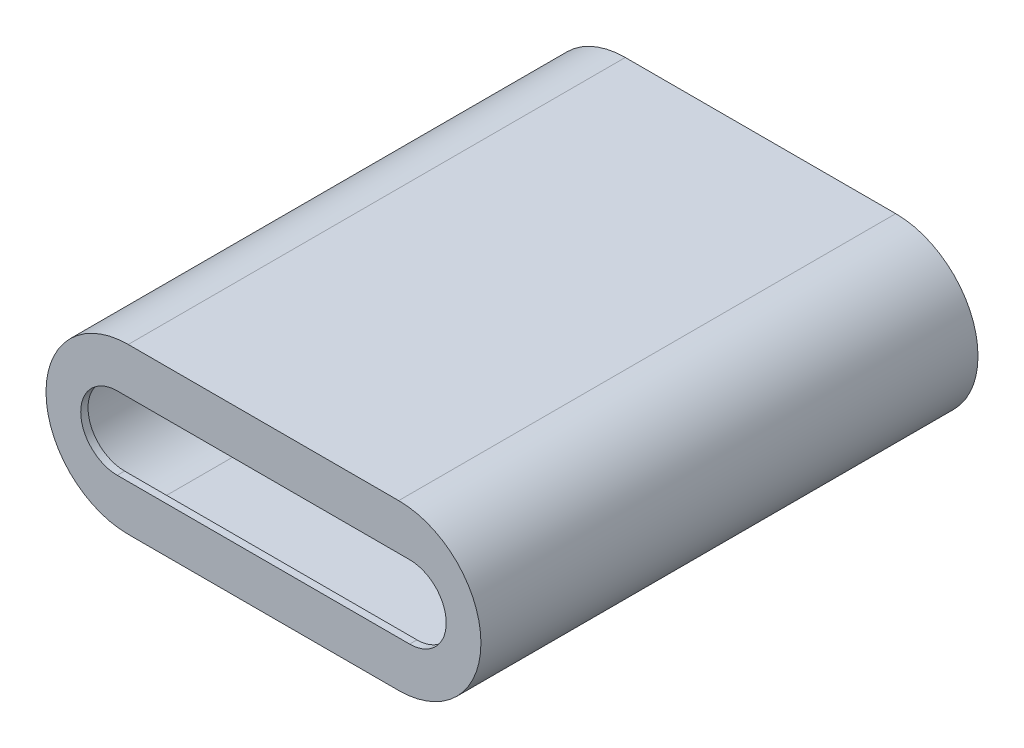
ISO-10303-21;
HEADER;
FILE_DESCRIPTION(('STEP AP214'),'2;1');
FILE_NAME('part.step','',(''),(''),'','','');
FILE_SCHEMA(('AUTOMOTIVE_DESIGN { 1 0 10303 214 1 1 1 1 }'));
ENDSEC;
DATA;
#1=APPLICATION_CONTEXT('core data for automotive mechanical design processes');
#2=APPLICATION_PROTOCOL_DEFINITION('international standard','automotive_design',2000,#1);
#3=PRODUCT_CONTEXT('',#1,'mechanical');
#4=PRODUCT('Part','Part','',(#3));
#5=PRODUCT_RELATED_PRODUCT_CATEGORY('part','',(#4));
#6=PRODUCT_DEFINITION_FORMATION('','',#4);
#7=PRODUCT_DEFINITION_CONTEXT('part definition',#1,'design');
#8=PRODUCT_DEFINITION('design','',#6,#7);
#9=PRODUCT_DEFINITION_SHAPE('','',#8);
#10=(LENGTH_UNIT() NAMED_UNIT(*) SI_UNIT(.MILLI.,.METRE.));
#11=(NAMED_UNIT(*) PLANE_ANGLE_UNIT() SI_UNIT($,.RADIAN.));
#12=(NAMED_UNIT(*) SI_UNIT($,.STERADIAN.) SOLID_ANGLE_UNIT());
#13=UNCERTAINTY_MEASURE_WITH_UNIT(LENGTH_MEASURE(1.E-05),#10,'distance_accuracy_value','');
#14=(GEOMETRIC_REPRESENTATION_CONTEXT(3) GLOBAL_UNCERTAINTY_ASSIGNED_CONTEXT((#13)) GLOBAL_UNIT_ASSIGNED_CONTEXT((#10,
#11,#12)) REPRESENTATION_CONTEXT('',''));
#15=CARTESIAN_POINT('',(0.,0.,0.));
#16=DIRECTION('',(0.,0.,1.));
#17=DIRECTION('',(1.,0.,0.));
#18=AXIS2_PLACEMENT_3D('',#15,#16,#17);
#19=CARTESIAN_POINT('',(-18.5,-9.25,34.));
#20=DIRECTION('',(0.,1.,0.));
#21=DIRECTION('',(-1.,0.,0.));
#22=AXIS2_PLACEMENT_3D('',#19,#20,#21);
#23=PLANE('',#22);
#24=DIRECTION('',(0.,0.,-1.));
#25=VECTOR('',#24,1.);
#26=CARTESIAN_POINT('',(18.5,-9.24999999999999,34.));
#27=LINE('',#26,#25);
#28=CARTESIAN_POINT('',(18.5,-9.24999999999999,33.));
#29=VERTEX_POINT('',#28);
#30=CARTESIAN_POINT('',(18.5,-9.25,8.));
#31=VERTEX_POINT('',#30);
#32=EDGE_CURVE('E328',#29,#31,#27,.T.);
#33=ORIENTED_EDGE('',*,*,#32,.T.);
#34=DIRECTION('',(1.,0.,0.));
#35=VECTOR('',#34,1.);
#36=CARTESIAN_POINT('',(-29.75,-9.25,8.));
#37=LINE('',#36,#35);
#38=CARTESIAN_POINT('',(-18.5,-9.25,8.));
#39=VERTEX_POINT('',#38);
#40=EDGE_CURVE('E413',#39,#31,#37,.T.);
#41=ORIENTED_EDGE('',*,*,#40,.F.);
#42=DIRECTION('',(0.,0.,-1.));
#43=VECTOR('',#42,1.);
#44=CARTESIAN_POINT('',(-18.5,-9.25,34.));
#45=LINE('',#44,#43);
#46=CARTESIAN_POINT('',(-18.5,-9.25,33.));
#47=VERTEX_POINT('',#46);
#48=EDGE_CURVE('E333',#47,#39,#45,.T.);
#49=ORIENTED_EDGE('',*,*,#48,.F.);
#50=DIRECTION('',(-1.,0.,0.));
#51=VECTOR('',#50,1.);
#52=CARTESIAN_POINT('',(-18.5,-9.25,33.));
#53=LINE('',#52,#51);
#54=EDGE_CURVE('E309',#29,#47,#53,.T.);
#55=ORIENTED_EDGE('',*,*,#54,.F.);
#56=EDGE_LOOP('',(#33,#41,#49,#55));
#57=FACE_BOUND('',#56,.T.);
#58=ADVANCED_FACE('F39',(#57),#23,.T.);
#59=CARTESIAN_POINT('',(-18.5,0.,34.));
#60=DIRECTION('',(0.,0.,-1.));
#61=DIRECTION('',(-1.,0.,0.));
#62=AXIS2_PLACEMENT_3D('',#59,#60,#61);
#63=CYLINDRICAL_SURFACE('',#62,11.25);
#64=CARTESIAN_POINT('',(-18.5,0.,8.));
#65=DIRECTION('',(0.,0.,-1.));
#66=DIRECTION('',(-1.,0.,0.));
#67=AXIS2_PLACEMENT_3D('',#64,#65,#66);
#68=CIRCLE('',#67,11.25);
#69=CARTESIAN_POINT('',(-18.5,-11.25,8.));
#70=VERTEX_POINT('',#69);
#71=CARTESIAN_POINT('',(-24.9031242374329,-9.25,8.));
#72=VERTEX_POINT('',#71);
#73=EDGE_CURVE('E224',#70,#72,#68,.T.);
#74=ORIENTED_EDGE('',*,*,#73,.F.);
#75=DIRECTION('',(0.,0.,-1.));
#76=VECTOR('',#75,1.);
#77=CARTESIAN_POINT('',(-18.5,-11.25,34.));
#78=LINE('',#77,#76);
#79=CARTESIAN_POINT('',(-18.5,-11.25,34.));
#80=VERTEX_POINT('',#79);
#81=EDGE_CURVE('E376',#80,#70,#78,.T.);
#82=ORIENTED_EDGE('',*,*,#81,.F.);
#83=CARTESIAN_POINT('',(-18.5,0.,34.));
#84=DIRECTION('',(0.,0.,1.));
#85=DIRECTION('',(1.,0.,0.));
#86=AXIS2_PLACEMENT_3D('',#83,#84,#85);
#87=CIRCLE('',#86,11.25);
#88=CARTESIAN_POINT('',(-18.5,11.25,34.));
#89=VERTEX_POINT('',#88);
#90=EDGE_CURVE('E338',#89,#80,#87,.T.);
#91=ORIENTED_EDGE('',*,*,#90,.F.);
#92=DIRECTION('',(0.,0.,-1.));
#93=VECTOR('',#92,1.);
#94=CARTESIAN_POINT('',(-18.5,11.25,34.));
#95=LINE('',#94,#93);
#96=CARTESIAN_POINT('',(-18.5,11.25,-34.));
#97=VERTEX_POINT('',#96);
#98=EDGE_CURVE('E352',#89,#97,#95,.T.);
#99=ORIENTED_EDGE('',*,*,#98,.T.);
#100=CARTESIAN_POINT('',(-18.5,0.,-34.));
#101=DIRECTION('',(0.,0.,1.));
#102=DIRECTION('',(1.,0.,0.));
#103=AXIS2_PLACEMENT_3D('',#100,#101,#102);
#104=CIRCLE('',#103,11.25);
#105=CARTESIAN_POINT('',(-18.5,-11.25,-34.));
#106=VERTEX_POINT('',#105);
#107=EDGE_CURVE('E337',#97,#106,#104,.T.);
#108=ORIENTED_EDGE('',*,*,#107,.T.);
#109=CARTESIAN_POINT('',(-18.5,-11.25,-8.00000000000001));
#110=VERTEX_POINT('',#109);
#111=EDGE_CURVE('E209',#110,#106,#78,.T.);
#112=ORIENTED_EDGE('',*,*,#111,.F.);
#113=CARTESIAN_POINT('',(-18.5,0.,-8.00000000000001));
#114=DIRECTION('',(0.,0.,-1.));
#115=DIRECTION('',(-1.,0.,0.));
#116=AXIS2_PLACEMENT_3D('',#113,#114,#115);
#117=CIRCLE('',#116,11.25);
#118=CARTESIAN_POINT('',(-24.9031242374328,-9.25,-8.00000000000001));
#119=VERTEX_POINT('',#118);
#120=EDGE_CURVE('E196',#110,#119,#117,.T.);
#121=ORIENTED_EDGE('',*,*,#120,.T.);
#122=DIRECTION('',(0.,0.,-1.));
#123=VECTOR('',#122,1.);
#124=CARTESIAN_POINT('',(-24.9031242374329,-9.24999999999999,34.));
#125=LINE('',#124,#123);
#126=EDGE_CURVE('E187',#119,#72,#125,.F.);
#127=ORIENTED_EDGE('',*,*,#126,.T.);
#128=EDGE_LOOP('',(#74,#82,#91,#99,#108,#112,#121,#127));
#129=FACE_BOUND('',#128,.T.);
#130=ADVANCED_FACE('F41',(#129),#63,.T.);
#131=CARTESIAN_POINT('',(-18.5,-11.25,34.));
#132=DIRECTION('',(0.,1.,0.));
#133=DIRECTION('',(-1.,0.,0.));
#134=AXIS2_PLACEMENT_3D('',#131,#132,#133);
#135=PLANE('',#134);
#136=DIRECTION('',(-1.,0.,0.));
#137=VECTOR('',#136,1.);
#138=CARTESIAN_POINT('',(-18.5,-11.25,8.));
#139=LINE('',#138,#137);
#140=CARTESIAN_POINT('',(18.5,-11.25,8.));
#141=VERTEX_POINT('',#140);
#142=EDGE_CURVE('E221',#141,#70,#139,.T.);
#143=ORIENTED_EDGE('',*,*,#142,.F.);
#144=DIRECTION('',(0.,0.,-1.));
#145=VECTOR('',#144,1.);
#146=CARTESIAN_POINT('',(18.5,-11.25,34.));
#147=LINE('',#146,#145);
#148=CARTESIAN_POINT('',(18.5,-11.25,34.));
#149=VERTEX_POINT('',#148);
#150=EDGE_CURVE('E372',#149,#141,#147,.T.);
#151=ORIENTED_EDGE('',*,*,#150,.F.);
#152=DIRECTION('',(1.,0.,0.));
#153=VECTOR('',#152,1.);
#154=CARTESIAN_POINT('',(-18.5,-11.25,34.));
#155=LINE('',#154,#153);
#156=EDGE_CURVE('E342',#80,#149,#155,.T.);
#157=ORIENTED_EDGE('',*,*,#156,.F.);
#158=ORIENTED_EDGE('',*,*,#81,.T.);
#159=EDGE_LOOP('',(#143,#151,#157,#158));
#160=FACE_BOUND('',#159,.T.);
#161=ADVANCED_FACE('F488',(#160),#135,.F.);
#162=CARTESIAN_POINT('',(18.5,0.,34.));
#163=DIRECTION('',(0.,0.,-1.));
#164=DIRECTION('',(-1.,0.,0.));
#165=AXIS2_PLACEMENT_3D('',#162,#163,#164);
#166=CYLINDRICAL_SURFACE('',#165,11.25);
#167=CARTESIAN_POINT('',(18.5,0.,8.));
#168=DIRECTION('',(0.,0.,-1.));
#169=DIRECTION('',(-1.,0.,0.));
#170=AXIS2_PLACEMENT_3D('',#167,#168,#169);
#171=CIRCLE('',#170,11.25);
#172=CARTESIAN_POINT('',(24.9031242374328,-9.25,8.));
#173=VERTEX_POINT('',#172);
#174=EDGE_CURVE('E11',#173,#141,#171,.T.);
#175=ORIENTED_EDGE('',*,*,#174,.F.);
#176=DIRECTION('',(0.,0.,-1.));
#177=VECTOR('',#176,1.);
#178=CARTESIAN_POINT('',(24.9031242374328,-9.24999999999999,34.));
#179=LINE('',#178,#177);
#180=CARTESIAN_POINT('',(24.9031242374328,-9.25,-8.00000000000001));
#181=VERTEX_POINT('',#180);
#182=EDGE_CURVE('E48',#173,#181,#179,.T.);
#183=ORIENTED_EDGE('',*,*,#182,.T.);
#184=CARTESIAN_POINT('',(18.5,0.,-8.00000000000001));
#185=DIRECTION('',(0.,0.,-1.));
#186=DIRECTION('',(-1.,0.,0.));
#187=AXIS2_PLACEMENT_3D('',#184,#185,#186);
#188=CIRCLE('',#187,11.25);
#189=CARTESIAN_POINT('',(18.5,-11.25,-8.00000000000001));
#190=VERTEX_POINT('',#189);
#191=EDGE_CURVE('E396',#181,#190,#188,.T.);
#192=ORIENTED_EDGE('',*,*,#191,.T.);
#193=CARTESIAN_POINT('',(18.5,-11.25,-34.));
#194=VERTEX_POINT('',#193);
#195=EDGE_CURVE('E371',#190,#194,#147,.T.);
#196=ORIENTED_EDGE('',*,*,#195,.T.);
#197=CARTESIAN_POINT('',(18.5,0.,-34.));
#198=DIRECTION('',(0.,0.,1.));
#199=DIRECTION('',(1.,0.,0.));
#200=AXIS2_PLACEMENT_3D('',#197,#198,#199);
#201=CIRCLE('',#200,11.25);
#202=CARTESIAN_POINT('',(18.5,11.25,-34.));
#203=VERTEX_POINT('',#202);
#204=EDGE_CURVE('E359',#194,#203,#201,.T.);
#205=ORIENTED_EDGE('',*,*,#204,.T.);
#206=DIRECTION('',(0.,0.,-1.));
#207=VECTOR('',#206,1.);
#208=CARTESIAN_POINT('',(18.5,11.25,34.));
#209=LINE('',#208,#207);
#210=CARTESIAN_POINT('',(18.5,11.25,34.));
#211=VERTEX_POINT('',#210);
#212=EDGE_CURVE('E367',#211,#203,#209,.T.);
#213=ORIENTED_EDGE('',*,*,#212,.F.);
#214=CARTESIAN_POINT('',(18.5,0.,34.));
#215=DIRECTION('',(0.,0.,1.));
#216=DIRECTION('',(1.,0.,0.));
#217=AXIS2_PLACEMENT_3D('',#214,#215,#216);
#218=CIRCLE('',#217,11.25);
#219=EDGE_CURVE('E346',#149,#211,#218,.T.);
#220=ORIENTED_EDGE('',*,*,#219,.F.);
#221=ORIENTED_EDGE('',*,*,#150,.T.);
#222=EDGE_LOOP('',(#175,#183,#192,#196,#205,#213,#220,#221));
#223=FACE_BOUND('',#222,.T.);
#224=ADVANCED_FACE('F402',(#223),#166,.T.);
#225=CARTESIAN_POINT('',(18.5,0.,-33.));
#226=DIRECTION('',(0.,0.,1.));
#227=DIRECTION('',(1.,0.,0.));
#228=AXIS2_PLACEMENT_3D('',#225,#226,#227);
#229=PLANE('',#228);
#230=CARTESIAN_POINT('',(-20.,0.,-33.));
#231=DIRECTION('',(0.,0.,1.));
#232=DIRECTION('',(1.,0.,0.));
#233=AXIS2_PLACEMENT_3D('',#230,#231,#232);
#234=CIRCLE('',#233,5.);
#235=CARTESIAN_POINT('',(-20.,5.,-33.));
#236=VERTEX_POINT('',#235);
#237=CARTESIAN_POINT('',(-20.,-5.,-33.));
#238=VERTEX_POINT('',#237);
#239=EDGE_CURVE('E286',#236,#238,#234,.T.);
#240=ORIENTED_EDGE('',*,*,#239,.F.);
#241=DIRECTION('',(-1.,0.,0.));
#242=VECTOR('',#241,1.);
#243=CARTESIAN_POINT('',(18.5,5.,-33.));
#244=LINE('',#243,#242);
#245=CARTESIAN_POINT('',(20.,5.,-33.));
#246=VERTEX_POINT('',#245);
#247=EDGE_CURVE('E283',#246,#236,#244,.T.);
#248=ORIENTED_EDGE('',*,*,#247,.F.);
#249=CARTESIAN_POINT('',(20.,0.,-33.));
#250=DIRECTION('',(0.,0.,1.));
#251=DIRECTION('',(1.,0.,0.));
#252=AXIS2_PLACEMENT_3D('',#249,#250,#251);
#253=CIRCLE('',#252,5.);
#254=CARTESIAN_POINT('',(20.,-5.,-33.));
#255=VERTEX_POINT('',#254);
#256=EDGE_CURVE('E280',#255,#246,#253,.T.);
#257=ORIENTED_EDGE('',*,*,#256,.F.);
#258=DIRECTION('',(1.,0.,0.));
#259=VECTOR('',#258,1.);
#260=CARTESIAN_POINT('',(18.5,-5.,-33.));
#261=LINE('',#260,#259);
#262=EDGE_CURVE('E263',#238,#255,#261,.T.);
#263=ORIENTED_EDGE('',*,*,#262,.F.);
#264=EDGE_LOOP('',(#240,#248,#257,#263));
#265=FACE_BOUND('',#264,.T.);
#266=DIRECTION('',(1.,0.,0.));
#267=VECTOR('',#266,1.);
#268=CARTESIAN_POINT('',(-18.5,9.25,-33.));
#269=LINE('',#268,#267);
#270=CARTESIAN_POINT('',(-18.5,9.25,-33.));
#271=VERTEX_POINT('',#270);
#272=CARTESIAN_POINT('',(18.5,9.25000000000001,-33.));
#273=VERTEX_POINT('',#272);
#274=EDGE_CURVE('E290',#271,#273,#269,.T.);
#275=ORIENTED_EDGE('',*,*,#274,.F.);
#276=CARTESIAN_POINT('',(-18.5,0.,-33.));
#277=DIRECTION('',(0.,0.,1.));
#278=DIRECTION('',(1.,0.,0.));
#279=AXIS2_PLACEMENT_3D('',#276,#277,#278);
#280=CIRCLE('',#279,9.25);
#281=CARTESIAN_POINT('',(-18.5,-9.25,-33.));
#282=VERTEX_POINT('',#281);
#283=EDGE_CURVE('E301',#271,#282,#280,.T.);
#284=ORIENTED_EDGE('',*,*,#283,.T.);
#285=DIRECTION('',(1.,0.,0.));
#286=VECTOR('',#285,1.);
#287=CARTESIAN_POINT('',(-18.5,-9.25,-33.));
#288=LINE('',#287,#286);
#289=CARTESIAN_POINT('',(18.5,-9.24999999999999,-33.));
#290=VERTEX_POINT('',#289);
#291=EDGE_CURVE('E297',#282,#290,#288,.T.);
#292=ORIENTED_EDGE('',*,*,#291,.T.);
#293=CARTESIAN_POINT('',(18.5,0.,-33.));
#294=DIRECTION('',(0.,0.,1.));
#295=DIRECTION('',(1.,0.,0.));
#296=AXIS2_PLACEMENT_3D('',#293,#294,#295);
#297=CIRCLE('',#296,9.25);
#298=EDGE_CURVE('E293',#290,#273,#297,.T.);
#299=ORIENTED_EDGE('',*,*,#298,.T.);
#300=EDGE_LOOP('',(#275,#284,#292,#299));
#301=FACE_BOUND('',#300,.T.);
#302=ADVANCED_FACE('F438',(#265,#301),#229,.T.);
#303=CARTESIAN_POINT('',(-18.5,0.,33.));
#304=DIRECTION('',(0.,0.,1.));
#305=DIRECTION('',(1.,0.,0.));
#306=AXIS2_PLACEMENT_3D('',#303,#304,#305);
#307=PLANE('',#306);
#308=DIRECTION('',(-1.,0.,0.));
#309=VECTOR('',#308,1.);
#310=CARTESIAN_POINT('',(-18.5,5.,33.));
#311=LINE('',#310,#309);
#312=CARTESIAN_POINT('',(20.,5.,33.));
#313=VERTEX_POINT('',#312);
#314=CARTESIAN_POINT('',(-20.,5.,33.));
#315=VERTEX_POINT('',#314);
#316=EDGE_CURVE('E388',#313,#315,#311,.T.);
#317=ORIENTED_EDGE('',*,*,#316,.T.);
#318=CARTESIAN_POINT('',(-20.,0.,33.));
#319=DIRECTION('',(0.,0.,1.));
#320=DIRECTION('',(1.,0.,0.));
#321=AXIS2_PLACEMENT_3D('',#318,#319,#320);
#322=CIRCLE('',#321,5.);
#323=CARTESIAN_POINT('',(-20.,-5.,33.));
#324=VERTEX_POINT('',#323);
#325=EDGE_CURVE('E392',#315,#324,#322,.T.);
#326=ORIENTED_EDGE('',*,*,#325,.T.);
#327=DIRECTION('',(1.,0.,0.));
#328=VECTOR('',#327,1.);
#329=CARTESIAN_POINT('',(-18.5,-5.,33.));
#330=LINE('',#329,#328);
#331=CARTESIAN_POINT('',(20.,-5.,33.));
#332=VERTEX_POINT('',#331);
#333=EDGE_CURVE('E380',#324,#332,#330,.T.);
#334=ORIENTED_EDGE('',*,*,#333,.T.);
#335=CARTESIAN_POINT('',(20.,0.,33.));
#336=DIRECTION('',(0.,0.,1.));
#337=DIRECTION('',(1.,0.,0.));
#338=AXIS2_PLACEMENT_3D('',#335,#336,#337);
#339=CIRCLE('',#338,5.);
#340=EDGE_CURVE('E384',#332,#313,#339,.T.);
#341=ORIENTED_EDGE('',*,*,#340,.T.);
#342=EDGE_LOOP('',(#317,#326,#334,#341));
#343=FACE_BOUND('',#342,.T.);
#344=CARTESIAN_POINT('',(-18.5,0.,33.));
#345=DIRECTION('',(0.,0.,1.));
#346=DIRECTION('',(1.,0.,0.));
#347=AXIS2_PLACEMENT_3D('',#344,#345,#346);
#348=CIRCLE('',#347,9.25);
#349=CARTESIAN_POINT('',(-18.5,9.25,33.));
#350=VERTEX_POINT('',#349);
#351=EDGE_CURVE('E305',#350,#47,#348,.T.);
#352=ORIENTED_EDGE('',*,*,#351,.F.);
#353=DIRECTION('',(-1.,0.,0.));
#354=VECTOR('',#353,1.);
#355=CARTESIAN_POINT('',(-18.5,9.25,33.));
#356=LINE('',#355,#354);
#357=CARTESIAN_POINT('',(18.5,9.25000000000001,33.));
#358=VERTEX_POINT('',#357);
#359=EDGE_CURVE('E316',#358,#350,#356,.T.);
#360=ORIENTED_EDGE('',*,*,#359,.F.);
#361=CARTESIAN_POINT('',(18.5,0.,33.));
#362=DIRECTION('',(0.,0.,1.));
#363=DIRECTION('',(1.,0.,0.));
#364=AXIS2_PLACEMENT_3D('',#361,#362,#363);
#365=CIRCLE('',#364,9.25);
#366=EDGE_CURVE('E312',#29,#358,#365,.T.);
#367=ORIENTED_EDGE('',*,*,#366,.F.);
#368=ORIENTED_EDGE('',*,*,#54,.T.);
#369=EDGE_LOOP('',(#352,#360,#367,#368));
#370=FACE_BOUND('',#369,.T.);
#371=ADVANCED_FACE('F428',(#343,#370),#307,.F.);
#372=CARTESIAN_POINT('',(-18.5,9.25,34.));
#373=DIRECTION('',(0.,-1.,0.));
#374=DIRECTION('',(1.,0.,0.));
#375=AXIS2_PLACEMENT_3D('',#372,#373,#374);
#376=PLANE('',#375);
#377=ORIENTED_EDGE('',*,*,#274,.T.);
#378=DIRECTION('',(0.,0.,-1.));
#379=VECTOR('',#378,1.);
#380=CARTESIAN_POINT('',(18.5,9.25000000000001,34.));
#381=LINE('',#380,#379);
#382=EDGE_CURVE('E323',#358,#273,#381,.T.);
#383=ORIENTED_EDGE('',*,*,#382,.F.);
#384=ORIENTED_EDGE('',*,*,#359,.T.);
#385=DIRECTION('',(0.,0.,-1.));
#386=VECTOR('',#385,1.);
#387=CARTESIAN_POINT('',(-18.5,9.25,34.));
#388=LINE('',#387,#386);
#389=EDGE_CURVE('E320',#350,#271,#388,.T.);
#390=ORIENTED_EDGE('',*,*,#389,.T.);
#391=EDGE_LOOP('',(#377,#383,#384,#390));
#392=FACE_BOUND('',#391,.T.);
#393=ADVANCED_FACE('F431',(#392),#376,.T.);
#394=CARTESIAN_POINT('',(18.5,0.,34.));
#395=DIRECTION('',(0.,0.,-1.));
#396=DIRECTION('',(-1.,0.,0.));
#397=AXIS2_PLACEMENT_3D('',#394,#395,#396);
#398=CYLINDRICAL_SURFACE('',#397,9.25);
#399=ORIENTED_EDGE('',*,*,#298,.F.);
#400=CARTESIAN_POINT('',(18.5,-9.25,-8.));
#401=VERTEX_POINT('',#400);
#402=EDGE_CURVE('E327',#401,#290,#27,.T.);
#403=ORIENTED_EDGE('',*,*,#402,.F.);
#404=DIRECTION('',(0.,0.,-1.));
#405=VECTOR('',#404,1.);
#406=CARTESIAN_POINT('',(18.5,-9.24999999999999,34.));
#407=LINE('',#406,#405);
#408=EDGE_CURVE('E218',#31,#401,#407,.T.);
#409=ORIENTED_EDGE('',*,*,#408,.F.);
#410=ORIENTED_EDGE('',*,*,#32,.F.);
#411=ORIENTED_EDGE('',*,*,#366,.T.);
#412=ORIENTED_EDGE('',*,*,#382,.T.);
#413=EDGE_LOOP('',(#399,#403,#409,#410,#411,#412));
#414=FACE_BOUND('',#413,.T.);
#415=ADVANCED_FACE('F435',(#414),#398,.F.);
#416=DIRECTION('',(1.,0.,0.));
#417=VECTOR('',#416,1.);
#418=CARTESIAN_POINT('',(-29.75,-9.25,-8.));
#419=LINE('',#418,#417);
#420=CARTESIAN_POINT('',(-18.5,-9.25,-8.00000000000001));
#421=VERTEX_POINT('',#420);
#422=EDGE_CURVE('E201',#421,#401,#419,.T.);
#423=ORIENTED_EDGE('',*,*,#422,.T.);
#424=ORIENTED_EDGE('',*,*,#402,.T.);
#425=ORIENTED_EDGE('',*,*,#291,.F.);
#426=EDGE_CURVE('E332',#421,#282,#45,.T.);
#427=ORIENTED_EDGE('',*,*,#426,.F.);
#428=EDGE_LOOP('',(#423,#424,#425,#427));
#429=FACE_BOUND('',#428,.T.);
#430=ADVANCED_FACE('F441',(#429),#23,.T.);
#431=CARTESIAN_POINT('',(-18.5,0.,34.));
#432=DIRECTION('',(0.,0.,-1.));
#433=DIRECTION('',(-1.,0.,0.));
#434=AXIS2_PLACEMENT_3D('',#431,#432,#433);
#435=CYLINDRICAL_SURFACE('',#434,9.25);
#436=ORIENTED_EDGE('',*,*,#283,.F.);
#437=ORIENTED_EDGE('',*,*,#389,.F.);
#438=ORIENTED_EDGE('',*,*,#351,.T.);
#439=ORIENTED_EDGE('',*,*,#48,.T.);
#440=DIRECTION('',(0.,0.,-1.));
#441=VECTOR('',#440,1.);
#442=CARTESIAN_POINT('',(-18.5,-9.25,34.));
#443=LINE('',#442,#441);
#444=EDGE_CURVE('E195',#39,#421,#443,.T.);
#445=ORIENTED_EDGE('',*,*,#444,.T.);
#446=ORIENTED_EDGE('',*,*,#426,.T.);
#447=EDGE_LOOP('',(#436,#437,#438,#439,#445,#446));
#448=FACE_BOUND('',#447,.T.);
#449=ADVANCED_FACE('F425',(#448),#435,.F.);
#450=CARTESIAN_POINT('',(-20.,-5.,-34.));
#451=DIRECTION('',(0.,-1.,0.));
#452=DIRECTION('',(0.,0.,-1.));
#453=AXIS2_PLACEMENT_3D('',#450,#451,#452);
#454=PLANE('',#453);
#455=DIRECTION('',(0.,0.,1.));
#456=VECTOR('',#455,1.);
#457=CARTESIAN_POINT('',(-20.,-5.,-34.));
#458=LINE('',#457,#456);
#459=CARTESIAN_POINT('',(-20.,-5.,34.));
#460=VERTEX_POINT('',#459);
#461=EDGE_CURVE('E258',#324,#460,#458,.T.);
#462=ORIENTED_EDGE('',*,*,#461,.T.);
#463=DIRECTION('',(1.,0.,0.));
#464=VECTOR('',#463,1.);
#465=CARTESIAN_POINT('',(-20.,-5.,34.));
#466=LINE('',#465,#464);
#467=CARTESIAN_POINT('',(20.,-5.,34.));
#468=VERTEX_POINT('',#467);
#469=EDGE_CURVE('E230',#460,#468,#466,.T.);
#470=ORIENTED_EDGE('',*,*,#469,.T.);
#471=DIRECTION('',(0.,0.,1.));
#472=VECTOR('',#471,1.);
#473=CARTESIAN_POINT('',(20.,-5.,-34.));
#474=LINE('',#473,#472);
#475=EDGE_CURVE('E274',#332,#468,#474,.T.);
#476=ORIENTED_EDGE('',*,*,#475,.F.);
#477=ORIENTED_EDGE('',*,*,#333,.F.);
#478=EDGE_LOOP('',(#462,#470,#476,#477));
#479=FACE_BOUND('',#478,.T.);
#480=ADVANCED_FACE('F452',(#479),#454,.F.);
#481=CARTESIAN_POINT('',(20.,0.,-34.));
#482=DIRECTION('',(0.,0.,1.));
#483=DIRECTION('',(1.,0.,0.));
#484=AXIS2_PLACEMENT_3D('',#481,#482,#483);
#485=CYLINDRICAL_SURFACE('',#484,5.);
#486=ORIENTED_EDGE('',*,*,#475,.T.);
#487=CARTESIAN_POINT('',(20.,0.,34.));
#488=DIRECTION('',(0.,0.,1.));
#489=DIRECTION('',(1.,0.,0.));
#490=AXIS2_PLACEMENT_3D('',#487,#488,#489);
#491=CIRCLE('',#490,5.);
#492=CARTESIAN_POINT('',(20.,5.,34.));
#493=VERTEX_POINT('',#492);
#494=EDGE_CURVE('E234',#468,#493,#491,.T.);
#495=ORIENTED_EDGE('',*,*,#494,.T.);
#496=DIRECTION('',(0.,0.,1.));
#497=VECTOR('',#496,1.);
#498=CARTESIAN_POINT('',(20.,5.,-34.));
#499=LINE('',#498,#497);
#500=EDGE_CURVE('E269',#313,#493,#499,.T.);
#501=ORIENTED_EDGE('',*,*,#500,.F.);
#502=ORIENTED_EDGE('',*,*,#340,.F.);
#503=EDGE_LOOP('',(#486,#495,#501,#502));
#504=FACE_BOUND('',#503,.T.);
#505=ADVANCED_FACE('F462',(#504),#485,.F.);
#506=CARTESIAN_POINT('',(-20.,5.,-34.));
#507=DIRECTION('',(0.,1.,0.));
#508=DIRECTION('',(0.,0.,1.));
#509=AXIS2_PLACEMENT_3D('',#506,#507,#508);
#510=PLANE('',#509);
#511=ORIENTED_EDGE('',*,*,#500,.T.);
#512=DIRECTION('',(-1.,0.,0.));
#513=VECTOR('',#512,1.);
#514=CARTESIAN_POINT('',(-20.,5.,34.));
#515=LINE('',#514,#513);
#516=CARTESIAN_POINT('',(-20.,5.,34.));
#517=VERTEX_POINT('',#516);
#518=EDGE_CURVE('E238',#493,#517,#515,.T.);
#519=ORIENTED_EDGE('',*,*,#518,.T.);
#520=DIRECTION('',(0.,0.,1.));
#521=VECTOR('',#520,1.);
#522=CARTESIAN_POINT('',(-20.,5.,-34.));
#523=LINE('',#522,#521);
#524=EDGE_CURVE('E264',#315,#517,#523,.T.);
#525=ORIENTED_EDGE('',*,*,#524,.F.);
#526=ORIENTED_EDGE('',*,*,#316,.F.);
#527=EDGE_LOOP('',(#511,#519,#525,#526));
#528=FACE_BOUND('',#527,.T.);
#529=ADVANCED_FACE('F468',(#528),#510,.F.);
#530=CARTESIAN_POINT('',(-20.,0.,-34.));
#531=DIRECTION('',(0.,0.,1.));
#532=DIRECTION('',(1.,0.,0.));
#533=AXIS2_PLACEMENT_3D('',#530,#531,#532);
#534=CYLINDRICAL_SURFACE('',#533,5.);
#535=ORIENTED_EDGE('',*,*,#524,.T.);
#536=CARTESIAN_POINT('',(-20.,0.,34.));
#537=DIRECTION('',(0.,0.,1.));
#538=DIRECTION('',(1.,0.,0.));
#539=AXIS2_PLACEMENT_3D('',#536,#537,#538);
#540=CIRCLE('',#539,5.);
#541=EDGE_CURVE('E227',#517,#460,#540,.T.);
#542=ORIENTED_EDGE('',*,*,#541,.T.);
#543=ORIENTED_EDGE('',*,*,#461,.F.);
#544=ORIENTED_EDGE('',*,*,#325,.F.);
#545=EDGE_LOOP('',(#535,#542,#543,#544));
#546=FACE_BOUND('',#545,.T.);
#547=ADVANCED_FACE('F466',(#546),#534,.F.);
#548=ORIENTED_EDGE('',*,*,#239,.T.);
#549=CARTESIAN_POINT('',(-20.,-5.,-34.));
#550=VERTEX_POINT('',#549);
#551=EDGE_CURVE('E275',#550,#238,#458,.T.);
#552=ORIENTED_EDGE('',*,*,#551,.F.);
#553=CARTESIAN_POINT('',(-20.,0.,-34.));
#554=DIRECTION('',(0.,0.,1.));
#555=DIRECTION('',(1.,0.,0.));
#556=AXIS2_PLACEMENT_3D('',#553,#554,#555);
#557=CIRCLE('',#556,5.);
#558=CARTESIAN_POINT('',(-20.,5.,-34.));
#559=VERTEX_POINT('',#558);
#560=EDGE_CURVE('E242',#559,#550,#557,.T.);
#561=ORIENTED_EDGE('',*,*,#560,.F.);
#562=EDGE_CURVE('E259',#559,#236,#523,.T.);
#563=ORIENTED_EDGE('',*,*,#562,.T.);
#564=EDGE_LOOP('',(#548,#552,#561,#563));
#565=FACE_BOUND('',#564,.T.);
#566=ADVANCED_FACE('F476',(#565),#534,.F.);
#567=ORIENTED_EDGE('',*,*,#247,.T.);
#568=ORIENTED_EDGE('',*,*,#562,.F.);
#569=DIRECTION('',(-1.,0.,0.));
#570=VECTOR('',#569,1.);
#571=CARTESIAN_POINT('',(-20.,5.,-34.));
#572=LINE('',#571,#570);
#573=CARTESIAN_POINT('',(20.,5.,-34.));
#574=VERTEX_POINT('',#573);
#575=EDGE_CURVE('E254',#574,#559,#572,.T.);
#576=ORIENTED_EDGE('',*,*,#575,.F.);
#577=EDGE_CURVE('E265',#574,#246,#499,.T.);
#578=ORIENTED_EDGE('',*,*,#577,.T.);
#579=EDGE_LOOP('',(#567,#568,#576,#578));
#580=FACE_BOUND('',#579,.T.);
#581=ADVANCED_FACE('F471',(#580),#510,.F.);
#582=ORIENTED_EDGE('',*,*,#256,.T.);
#583=ORIENTED_EDGE('',*,*,#577,.F.);
#584=CARTESIAN_POINT('',(20.,0.,-34.));
#585=DIRECTION('',(0.,0.,1.));
#586=DIRECTION('',(1.,0.,0.));
#587=AXIS2_PLACEMENT_3D('',#584,#585,#586);
#588=CIRCLE('',#587,5.);
#589=CARTESIAN_POINT('',(20.,-5.,-34.));
#590=VERTEX_POINT('',#589);
#591=EDGE_CURVE('E250',#590,#574,#588,.T.);
#592=ORIENTED_EDGE('',*,*,#591,.F.);
#593=EDGE_CURVE('E270',#590,#255,#474,.T.);
#594=ORIENTED_EDGE('',*,*,#593,.T.);
#595=EDGE_LOOP('',(#582,#583,#592,#594));
#596=FACE_BOUND('',#595,.T.);
#597=ADVANCED_FACE('F479',(#596),#485,.F.);
#598=ORIENTED_EDGE('',*,*,#262,.T.);
#599=ORIENTED_EDGE('',*,*,#593,.F.);
#600=DIRECTION('',(1.,0.,0.));
#601=VECTOR('',#600,1.);
#602=CARTESIAN_POINT('',(-20.,-5.,-34.));
#603=LINE('',#602,#601);
#604=EDGE_CURVE('E246',#550,#590,#603,.T.);
#605=ORIENTED_EDGE('',*,*,#604,.F.);
#606=ORIENTED_EDGE('',*,*,#551,.T.);
#607=EDGE_LOOP('',(#598,#599,#605,#606));
#608=FACE_BOUND('',#607,.T.);
#609=ADVANCED_FACE('F508',(#608),#454,.F.);
#610=CARTESIAN_POINT('',(-18.5,0.,34.));
#611=DIRECTION('',(0.,0.,1.));
#612=DIRECTION('',(1.,0.,0.));
#613=AXIS2_PLACEMENT_3D('',#610,#611,#612);
#614=PLANE('',#613);
#615=ORIENTED_EDGE('',*,*,#541,.F.);
#616=ORIENTED_EDGE('',*,*,#518,.F.);
#617=ORIENTED_EDGE('',*,*,#494,.F.);
#618=ORIENTED_EDGE('',*,*,#469,.F.);
#619=EDGE_LOOP('',(#615,#616,#617,#618));
#620=FACE_BOUND('',#619,.T.);
#621=ORIENTED_EDGE('',*,*,#90,.T.);
#622=ORIENTED_EDGE('',*,*,#156,.T.);
#623=ORIENTED_EDGE('',*,*,#219,.T.);
#624=DIRECTION('',(-1.,0.,0.));
#625=VECTOR('',#624,1.);
#626=CARTESIAN_POINT('',(-18.5,11.25,34.));
#627=LINE('',#626,#625);
#628=EDGE_CURVE('E349',#211,#89,#627,.T.);
#629=ORIENTED_EDGE('',*,*,#628,.T.);
#630=EDGE_LOOP('',(#621,#622,#623,#629));
#631=FACE_BOUND('',#630,.T.);
#632=ADVANCED_FACE('F457',(#620,#631),#614,.T.);
#633=CARTESIAN_POINT('',(-18.5,0.,-34.));
#634=DIRECTION('',(0.,0.,1.));
#635=DIRECTION('',(1.,0.,0.));
#636=AXIS2_PLACEMENT_3D('',#633,#634,#635);
#637=PLANE('',#636);
#638=ORIENTED_EDGE('',*,*,#575,.T.);
#639=ORIENTED_EDGE('',*,*,#560,.T.);
#640=ORIENTED_EDGE('',*,*,#604,.T.);
#641=ORIENTED_EDGE('',*,*,#591,.T.);
#642=EDGE_LOOP('',(#638,#639,#640,#641));
#643=FACE_BOUND('',#642,.T.);
#644=ORIENTED_EDGE('',*,*,#107,.F.);
#645=DIRECTION('',(-1.,0.,0.));
#646=VECTOR('',#645,1.);
#647=CARTESIAN_POINT('',(-18.5,11.25,-34.));
#648=LINE('',#647,#646);
#649=EDGE_CURVE('E343',#203,#97,#648,.T.);
#650=ORIENTED_EDGE('',*,*,#649,.F.);
#651=ORIENTED_EDGE('',*,*,#204,.F.);
#652=DIRECTION('',(1.,0.,0.));
#653=VECTOR('',#652,1.);
#654=CARTESIAN_POINT('',(-18.5,-11.25,-34.));
#655=LINE('',#654,#653);
#656=EDGE_CURVE('E355',#106,#194,#655,.T.);
#657=ORIENTED_EDGE('',*,*,#656,.F.);
#658=EDGE_LOOP('',(#644,#650,#651,#657));
#659=FACE_BOUND('',#658,.T.);
#660=ADVANCED_FACE('F524',(#643,#659),#637,.F.);
#661=ORIENTED_EDGE('',*,*,#195,.F.);
#662=DIRECTION('',(-1.,0.,0.));
#663=VECTOR('',#662,1.);
#664=CARTESIAN_POINT('',(-18.5,-11.25,-8.00000000000001));
#665=LINE('',#664,#663);
#666=EDGE_CURVE('E63',#190,#110,#665,.T.);
#667=ORIENTED_EDGE('',*,*,#666,.T.);
#668=ORIENTED_EDGE('',*,*,#111,.T.);
#669=ORIENTED_EDGE('',*,*,#656,.T.);
#670=EDGE_LOOP('',(#661,#667,#668,#669));
#671=FACE_BOUND('',#670,.T.);
#672=ADVANCED_FACE('F527',(#671),#135,.F.);
#673=CARTESIAN_POINT('',(-18.5,11.25,34.));
#674=DIRECTION('',(0.,-1.,0.));
#675=DIRECTION('',(0.,0.,-1.));
#676=AXIS2_PLACEMENT_3D('',#673,#674,#675);
#677=PLANE('',#676);
#678=ORIENTED_EDGE('',*,*,#649,.T.);
#679=ORIENTED_EDGE('',*,*,#98,.F.);
#680=ORIENTED_EDGE('',*,*,#628,.F.);
#681=ORIENTED_EDGE('',*,*,#212,.T.);
#682=EDGE_LOOP('',(#678,#679,#680,#681));
#683=FACE_BOUND('',#682,.T.);
#684=ADVANCED_FACE('F538',(#683),#677,.F.);
#685=CARTESIAN_POINT('',(-29.75,0.,8.));
#686=DIRECTION('',(0.,0.,-1.));
#687=DIRECTION('',(-1.,0.,0.));
#688=AXIS2_PLACEMENT_3D('',#685,#686,#687);
#689=PLANE('',#688);
#690=ORIENTED_EDGE('',*,*,#73,.T.);
#691=EDGE_CURVE('E190',#72,#39,#37,.T.);
#692=ORIENTED_EDGE('',*,*,#691,.T.);
#693=ORIENTED_EDGE('',*,*,#40,.T.);
#694=EDGE_CURVE('E204',#31,#173,#37,.T.);
#695=ORIENTED_EDGE('',*,*,#694,.T.);
#696=ORIENTED_EDGE('',*,*,#174,.T.);
#697=ORIENTED_EDGE('',*,*,#142,.T.);
#698=EDGE_LOOP('',(#690,#692,#693,#695,#696,#697));
#699=FACE_BOUND('',#698,.T.);
#700=ADVANCED_FACE('F410',(#699),#689,.T.);
#701=CARTESIAN_POINT('',(-29.75,-9.25,0.));
#702=DIRECTION('',(0.,1.,0.));
#703=DIRECTION('',(0.,0.,1.));
#704=AXIS2_PLACEMENT_3D('',#701,#702,#703);
#705=PLANE('',#704);
#706=ORIENTED_EDGE('',*,*,#691,.F.);
#707=ORIENTED_EDGE('',*,*,#126,.F.);
#708=EDGE_CURVE('E55',#119,#421,#419,.T.);
#709=ORIENTED_EDGE('',*,*,#708,.T.);
#710=ORIENTED_EDGE('',*,*,#444,.F.);
#711=EDGE_LOOP('',(#706,#707,#709,#710));
#712=FACE_BOUND('',#711,.T.);
#713=ADVANCED_FACE('F188',(#712),#705,.F.);
#714=ORIENTED_EDGE('',*,*,#408,.T.);
#715=EDGE_CURVE('E206',#401,#181,#419,.T.);
#716=ORIENTED_EDGE('',*,*,#715,.T.);
#717=ORIENTED_EDGE('',*,*,#182,.F.);
#718=ORIENTED_EDGE('',*,*,#694,.F.);
#719=EDGE_LOOP('',(#714,#716,#717,#718));
#720=FACE_BOUND('',#719,.T.);
#721=ADVANCED_FACE('F407',(#720),#705,.F.);
#722=CARTESIAN_POINT('',(-29.75,0.,-8.));
#723=DIRECTION('',(0.,0.,-1.));
#724=DIRECTION('',(-1.,0.,0.));
#725=AXIS2_PLACEMENT_3D('',#722,#723,#724);
#726=PLANE('',#725);
#727=ORIENTED_EDGE('',*,*,#666,.F.);
#728=ORIENTED_EDGE('',*,*,#191,.F.);
#729=ORIENTED_EDGE('',*,*,#715,.F.);
#730=ORIENTED_EDGE('',*,*,#422,.F.);
#731=ORIENTED_EDGE('',*,*,#708,.F.);
#732=ORIENTED_EDGE('',*,*,#120,.F.);
#733=EDGE_LOOP('',(#727,#728,#729,#730,#731,#732));
#734=FACE_BOUND('',#733,.T.);
#735=ADVANCED_FACE('F198',(#734),#726,.F.);
#736=CLOSED_SHELL('',(#58,#130,#161,#224,#302,#371,#393,#415,#430,#449,#480,#505,#529,#547,#566,
#581,#597,#609,#632,#660,#672,#684,#700,#713,#721,#735));
#737=MANIFOLD_SOLID_BREP('B2',#736);
#738=ADVANCED_BREP_SHAPE_REPRESENTATION('',(#18,#737),#14);
#739=SHAPE_DEFINITION_REPRESENTATION(#9,#738);
ENDSEC;
END-ISO-10303-21;
